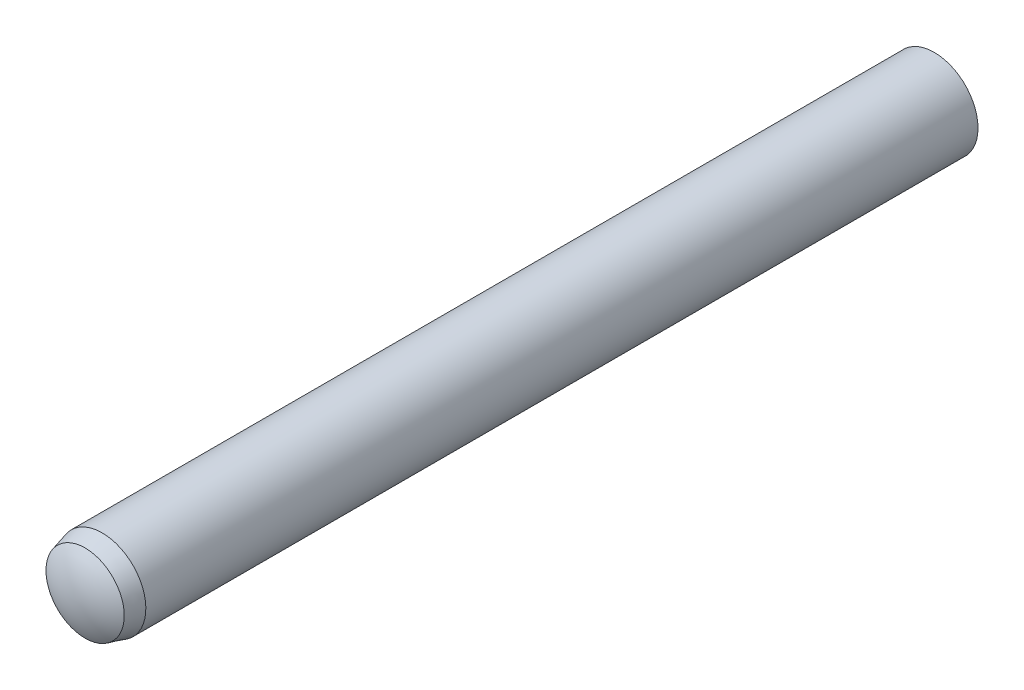
ISO-10303-21;
HEADER;
FILE_DESCRIPTION(('STEP AP214'),'2;1');
FILE_NAME('part.step','',(''),(''),'','','');
FILE_SCHEMA(('AUTOMOTIVE_DESIGN { 1 0 10303 214 1 1 1 1 }'));
ENDSEC;
DATA;
#1=APPLICATION_CONTEXT('core data for automotive mechanical design processes');
#2=APPLICATION_PROTOCOL_DEFINITION('international standard','automotive_design',2000,#1);
#3=PRODUCT_CONTEXT('',#1,'mechanical');
#4=PRODUCT('Part','Part','',(#3));
#5=PRODUCT_RELATED_PRODUCT_CATEGORY('part','',(#4));
#6=PRODUCT_DEFINITION_FORMATION('','',#4);
#7=PRODUCT_DEFINITION_CONTEXT('part definition',#1,'design');
#8=PRODUCT_DEFINITION('design','',#6,#7);
#9=PRODUCT_DEFINITION_SHAPE('','',#8);
#10=(LENGTH_UNIT() NAMED_UNIT(*) SI_UNIT(.MILLI.,.METRE.));
#11=(NAMED_UNIT(*) PLANE_ANGLE_UNIT() SI_UNIT($,.RADIAN.));
#12=(NAMED_UNIT(*) SI_UNIT($,.STERADIAN.) SOLID_ANGLE_UNIT());
#13=UNCERTAINTY_MEASURE_WITH_UNIT(LENGTH_MEASURE(1.E-05),#10,'distance_accuracy_value','');
#14=(GEOMETRIC_REPRESENTATION_CONTEXT(3) GLOBAL_UNCERTAINTY_ASSIGNED_CONTEXT((#13)) GLOBAL_UNIT_ASSIGNED_CONTEXT((#10,
#11,#12)) REPRESENTATION_CONTEXT('',''));
#15=CARTESIAN_POINT('',(0.,0.,0.));
#16=DIRECTION('',(0.,0.,1.));
#17=DIRECTION('',(1.,0.,0.));
#18=AXIS2_PLACEMENT_3D('',#15,#16,#17);
#19=CARTESIAN_POINT('',(0.,0.,-40.9166666666667));
#20=DIRECTION('',(0.,0.,1.));
#21=DIRECTION('',(0.,1.,0.));
#22=AXIS2_PLACEMENT_3D('',#19,#20,#21);
#23=SPHERICAL_SURFACE('',#22,9.08333333333328);
#24=CARTESIAN_POINT('',(0.,0.,-48.5));
#25=DIRECTION('',(0.,0.,1.));
#26=DIRECTION('',(0.,-1.,0.));
#27=AXIS2_PLACEMENT_3D('',#24,#25,#26);
#28=CIRCLE('',#27,4.99999999999998);
#29=CARTESIAN_POINT('',(0.,-4.99999999999997,-48.5));
#30=VERTEX_POINT('',#29);
#31=EDGE_CURVE('E10',#30,#30,#28,.T.);
#32=ORIENTED_EDGE('',*,*,#31,.F.);
#33=EDGE_LOOP('',(#32));
#34=FACE_BOUND('',#33,.T.);
#35=ADVANCED_FACE('F32',(#34),#23,.T.);
#36=CARTESIAN_POINT('',(0.,0.,50.));
#37=DIRECTION('',(0.,0.,1.));
#38=DIRECTION('',(0.,-1.,0.));
#39=AXIS2_PLACEMENT_3D('',#36,#37,#38);
#40=CYLINDRICAL_SURFACE('',#39,4.99999999999999);
#41=CARTESIAN_POINT('',(0.,0.,46.75));
#42=DIRECTION('',(0.,0.,1.));
#43=DIRECTION('',(0.,-1.,0.));
#44=AXIS2_PLACEMENT_3D('',#41,#42,#43);
#45=CIRCLE('',#44,5.);
#46=CARTESIAN_POINT('',(0.,-5.,46.75));
#47=VERTEX_POINT('',#46);
#48=EDGE_CURVE('E38',#47,#47,#45,.T.);
#49=ORIENTED_EDGE('',*,*,#48,.F.);
#50=EDGE_LOOP('',(#49));
#51=FACE_BOUND('',#50,.T.);
#52=ORIENTED_EDGE('',*,*,#31,.T.);
#53=EDGE_LOOP('',(#52));
#54=FACE_BOUND('',#53,.T.);
#55=ADVANCED_FACE('F53',(#51,#54),#40,.T.);
#56=CARTESIAN_POINT('',(0.,0.,46.75));
#57=DIRECTION('',(0.,0.,-1.));
#58=DIRECTION('',(0.,1.,0.));
#59=AXIS2_PLACEMENT_3D('',#56,#57,#58);
#60=CONICAL_SURFACE('',#59,5.,0.26179938779915);
#61=CARTESIAN_POINT('',(0.,0.,48.7));
#62=DIRECTION('',(0.,0.,1.));
#63=DIRECTION('',(0.,-1.,0.));
#64=AXIS2_PLACEMENT_3D('',#61,#62,#63);
#65=CIRCLE('',#64,4.47749907475931);
#66=CARTESIAN_POINT('',(0.,-4.47749907475931,48.7));
#67=VERTEX_POINT('',#66);
#68=EDGE_CURVE('E42',#67,#67,#65,.T.);
#69=ORIENTED_EDGE('',*,*,#68,.F.);
#70=EDGE_LOOP('',(#69));
#71=FACE_BOUND('',#70,.T.);
#72=ORIENTED_EDGE('',*,*,#48,.T.);
#73=EDGE_LOOP('',(#72));
#74=FACE_BOUND('',#73,.T.);
#75=ADVANCED_FACE('F51',(#71,#74),#60,.T.);
#76=CARTESIAN_POINT('',(0.,0.,41.6392315521268));
#77=DIRECTION('',(0.,0.,1.));
#78=DIRECTION('',(0.,1.,0.));
#79=AXIS2_PLACEMENT_3D('',#76,#77,#78);
#80=SPHERICAL_SURFACE('',#79,8.36076844787324);
#81=ORIENTED_EDGE('',*,*,#68,.T.);
#82=EDGE_LOOP('',(#81));
#83=FACE_BOUND('',#82,.T.);
#84=ADVANCED_FACE('F49',(#83),#80,.T.);
#85=CLOSED_SHELL('',(#35,#55,#75,#84));
#86=MANIFOLD_SOLID_BREP('B2',#85);
#87=ADVANCED_BREP_SHAPE_REPRESENTATION('',(#18,#86),#14);
#88=SHAPE_DEFINITION_REPRESENTATION(#9,#87);
ENDSEC;
END-ISO-10303-21;
